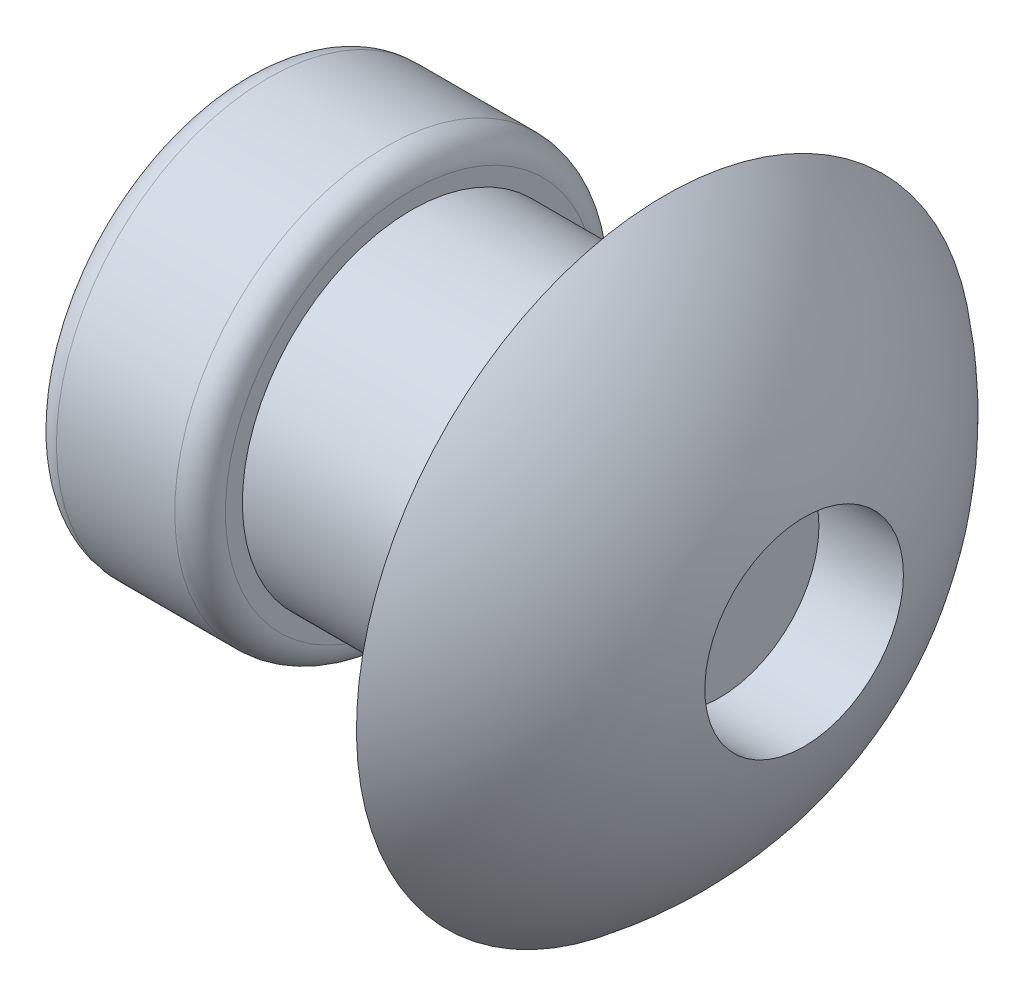
ISO-10303-21;
HEADER;
FILE_DESCRIPTION(('STEP AP214'),'2;1');
FILE_NAME('part.step','',(''),(''),'','','');
FILE_SCHEMA(('AUTOMOTIVE_DESIGN { 1 0 10303 214 1 1 1 1 }'));
ENDSEC;
DATA;
#1=APPLICATION_CONTEXT('core data for automotive mechanical design processes');
#2=APPLICATION_PROTOCOL_DEFINITION('international standard','automotive_design',2000,#1);
#3=PRODUCT_CONTEXT('',#1,'mechanical');
#4=PRODUCT('Part','Part','',(#3));
#5=PRODUCT_RELATED_PRODUCT_CATEGORY('part','',(#4));
#6=PRODUCT_DEFINITION_FORMATION('','',#4);
#7=PRODUCT_DEFINITION_CONTEXT('part definition',#1,'design');
#8=PRODUCT_DEFINITION('design','',#6,#7);
#9=PRODUCT_DEFINITION_SHAPE('','',#8);
#10=(LENGTH_UNIT() NAMED_UNIT(*) SI_UNIT(.MILLI.,.METRE.));
#11=(NAMED_UNIT(*) PLANE_ANGLE_UNIT() SI_UNIT($,.RADIAN.));
#12=(NAMED_UNIT(*) SI_UNIT($,.STERADIAN.) SOLID_ANGLE_UNIT());
#13=UNCERTAINTY_MEASURE_WITH_UNIT(LENGTH_MEASURE(1.E-05),#10,'distance_accuracy_value','');
#14=(GEOMETRIC_REPRESENTATION_CONTEXT(3) GLOBAL_UNCERTAINTY_ASSIGNED_CONTEXT((#13)) GLOBAL_UNIT_ASSIGNED_CONTEXT((#10,
#11,#12)) REPRESENTATION_CONTEXT('',''));
#15=CARTESIAN_POINT('',(0.,0.,0.));
#16=DIRECTION('',(0.,0.,1.));
#17=DIRECTION('',(1.,0.,0.));
#18=AXIS2_PLACEMENT_3D('',#15,#16,#17);
#19=CARTESIAN_POINT('',(2.5,-2.,0.));
#20=DIRECTION('',(-1.,0.,0.));
#21=DIRECTION('',(0.,-1.,0.));
#22=AXIS2_PLACEMENT_3D('',#19,#20,#21);
#23=PLANE('',#22);
#24=CARTESIAN_POINT('',(2.5,0.,0.));
#25=DIRECTION('',(1.,0.,0.));
#26=DIRECTION('',(0.,1.,0.));
#27=AXIS2_PLACEMENT_3D('',#24,#25,#26);
#28=CIRCLE('',#27,2.);
#29=CARTESIAN_POINT('',(2.5,2.,0.));
#30=VERTEX_POINT('',#29);
#31=EDGE_CURVE('E68',#30,#30,#28,.T.);
#32=ORIENTED_EDGE('',*,*,#31,.F.);
#33=EDGE_LOOP('',(#32));
#34=FACE_BOUND('',#33,.T.);
#35=CARTESIAN_POINT('',(2.5,0.,0.));
#36=DIRECTION('',(1.,0.,0.));
#37=DIRECTION('',(0.,1.,0.));
#38=AXIS2_PLACEMENT_3D('',#35,#36,#37);
#39=CIRCLE('',#38,2.2);
#40=CARTESIAN_POINT('',(2.5,2.2,0.));
#41=VERTEX_POINT('',#40);
#42=EDGE_CURVE('E44',#41,#41,#39,.T.);
#43=ORIENTED_EDGE('',*,*,#42,.T.);
#44=EDGE_LOOP('',(#43));
#45=FACE_BOUND('',#44,.T.);
#46=ADVANCED_FACE('F33',(#34,#45),#23,.F.);
#47=CARTESIAN_POINT('',(2.2,0.,0.));
#48=DIRECTION('',(1.,0.,0.));
#49=DIRECTION('',(0.,1.,0.));
#50=AXIS2_PLACEMENT_3D('',#47,#48,#49);
#51=TOROIDAL_SURFACE('',#50,2.2,0.300000000000001);
#52=ORIENTED_EDGE('',*,*,#42,.F.);
#53=EDGE_LOOP('',(#52));
#54=FACE_BOUND('',#53,.T.);
#55=CARTESIAN_POINT('',(2.2,0.,0.));
#56=DIRECTION('',(1.,0.,0.));
#57=DIRECTION('',(0.,1.,0.));
#58=AXIS2_PLACEMENT_3D('',#55,#56,#57);
#59=CIRCLE('',#58,2.5);
#60=CARTESIAN_POINT('',(2.2,2.5,0.));
#61=VERTEX_POINT('',#60);
#62=EDGE_CURVE('E48',#61,#61,#59,.T.);
#63=ORIENTED_EDGE('',*,*,#62,.T.);
#64=EDGE_LOOP('',(#63));
#65=FACE_BOUND('',#64,.T.);
#66=ADVANCED_FACE('F102',(#54,#65),#51,.T.);
#67=CARTESIAN_POINT('',(22.234231881893,0.,0.));
#68=DIRECTION('',(1.,0.,0.));
#69=DIRECTION('',(0.,1.,0.));
#70=AXIS2_PLACEMENT_3D('',#67,#68,#69);
#71=CYLINDRICAL_SURFACE('',#70,2.5);
#72=ORIENTED_EDGE('',*,*,#62,.F.);
#73=EDGE_LOOP('',(#72));
#74=FACE_BOUND('',#73,.T.);
#75=CARTESIAN_POINT('',(0.800000000000002,0.,0.));
#76=DIRECTION('',(1.,0.,0.));
#77=DIRECTION('',(0.,1.,0.));
#78=AXIS2_PLACEMENT_3D('',#75,#76,#77);
#79=CIRCLE('',#78,2.5);
#80=CARTESIAN_POINT('',(0.800000000000002,2.5,0.));
#81=VERTEX_POINT('',#80);
#82=EDGE_CURVE('E53',#81,#81,#79,.T.);
#83=ORIENTED_EDGE('',*,*,#82,.T.);
#84=EDGE_LOOP('',(#83));
#85=FACE_BOUND('',#84,.T.);
#86=ADVANCED_FACE('F107',(#74,#85),#71,.T.);
#87=CARTESIAN_POINT('',(0.800000000000002,0.,0.));
#88=DIRECTION('',(1.,0.,0.));
#89=DIRECTION('',(0.,1.,0.));
#90=AXIS2_PLACEMENT_3D('',#87,#88,#89);
#91=TOROIDAL_SURFACE('',#90,2.2,0.300000000000003);
#92=ORIENTED_EDGE('',*,*,#82,.F.);
#93=EDGE_LOOP('',(#92));
#94=FACE_BOUND('',#93,.T.);
#95=CARTESIAN_POINT('',(0.5,0.,0.));
#96=DIRECTION('',(1.,0.,0.));
#97=DIRECTION('',(0.,1.,0.));
#98=AXIS2_PLACEMENT_3D('',#95,#96,#97);
#99=CIRCLE('',#98,2.2);
#100=CARTESIAN_POINT('',(0.5,2.2,0.));
#101=VERTEX_POINT('',#100);
#102=EDGE_CURVE('E56',#101,#101,#99,.T.);
#103=ORIENTED_EDGE('',*,*,#102,.T.);
#104=EDGE_LOOP('',(#103));
#105=FACE_BOUND('',#104,.T.);
#106=ADVANCED_FACE('F115',(#94,#105),#91,.T.);
#107=CARTESIAN_POINT('',(0.500000000000002,-2.2,0.));
#108=DIRECTION('',(1.,0.,0.));
#109=DIRECTION('',(0.,1.,0.));
#110=AXIS2_PLACEMENT_3D('',#107,#108,#109);
#111=PLANE('',#110);
#112=ORIENTED_EDGE('',*,*,#102,.F.);
#113=EDGE_LOOP('',(#112));
#114=FACE_BOUND('',#113,.T.);
#115=CARTESIAN_POINT('',(0.5,0.,0.));
#116=DIRECTION('',(1.,0.,0.));
#117=DIRECTION('',(0.,1.,0.));
#118=AXIS2_PLACEMENT_3D('',#115,#116,#117);
#119=CIRCLE('',#118,1.8747533557385);
#120=CARTESIAN_POINT('',(0.5,1.8747533557385,0.));
#121=VERTEX_POINT('',#120);
#122=EDGE_CURVE('E59',#121,#121,#119,.T.);
#123=ORIENTED_EDGE('',*,*,#122,.T.);
#124=EDGE_LOOP('',(#123));
#125=FACE_BOUND('',#124,.T.);
#126=ADVANCED_FACE('F119',(#114,#125),#111,.F.);
#127=CARTESIAN_POINT('',(0.984568433375762,0.,0.));
#128=DIRECTION('',(1.,0.,0.));
#129=DIRECTION('',(0.,1.,0.));
#130=AXIS2_PLACEMENT_3D('',#127,#128,#129);
#131=TOROIDAL_SURFACE('',#130,1.,1.);
#132=ORIENTED_EDGE('',*,*,#122,.F.);
#133=EDGE_LOOP('',(#132));
#134=FACE_BOUND('',#133,.T.);
#135=CARTESIAN_POINT('',(0.,0.,0.));
#136=DIRECTION('',(1.,0.,0.));
#137=DIRECTION('',(0.,1.,0.));
#138=AXIS2_PLACEMENT_3D('',#135,#136,#137);
#139=CIRCLE('',#138,1.175);
#140=CARTESIAN_POINT('',(0.,1.175,0.));
#141=VERTEX_POINT('',#140);
#142=EDGE_CURVE('E62',#141,#141,#139,.T.);
#143=ORIENTED_EDGE('',*,*,#142,.T.);
#144=EDGE_LOOP('',(#143));
#145=FACE_BOUND('',#144,.T.);
#146=ADVANCED_FACE('F123',(#134,#145),#131,.T.);
#147=CARTESIAN_POINT('',(0.,-1.175,0.));
#148=DIRECTION('',(1.,0.,0.));
#149=DIRECTION('',(0.,1.,0.));
#150=AXIS2_PLACEMENT_3D('',#147,#148,#149);
#151=PLANE('',#150);
#152=ORIENTED_EDGE('',*,*,#142,.F.);
#153=EDGE_LOOP('',(#152));
#154=FACE_BOUND('',#153,.T.);
#155=ADVANCED_FACE('F90',(#154),#151,.F.);
#156=CARTESIAN_POINT('',(2.69930555555555,0.,0.));
#157=DIRECTION('',(1.,0.,0.));
#158=DIRECTION('',(0.,-1.,0.));
#159=AXIS2_PLACEMENT_3D('',#156,#157,#158);
#160=SPHERICAL_SURFACE('',#159,4.60069444444444);
#161=CARTESIAN_POINT('',(7.14742475035485,0.,0.));
#162=DIRECTION('',(-1.,0.,0.));
#163=DIRECTION('',(0.,0.,1.));
#164=AXIS2_PLACEMENT_3D('',#161,#162,#163);
#165=CIRCLE('',#164,1.175);
#166=CARTESIAN_POINT('',(7.14742475035485,-1.17500000000001,0.));
#167=VERTEX_POINT('',#166);
#168=EDGE_CURVE('E71',#167,#167,#165,.T.);
#169=CARTESIAN_POINT('',(5.5,0.,0.));
#170=DIRECTION('',(1.,0.,0.));
#171=DIRECTION('',(0.,1.,0.));
#172=AXIS2_PLACEMENT_3D('',#169,#170,#171);
#173=CIRCLE('',#172,3.65);
#174=CARTESIAN_POINT('',(5.5,-3.65,0.));
#175=VERTEX_POINT('',#174);
#176=EDGE_CURVE('E65',#175,#175,#173,.T.);
#177=CARTESIAN_POINT('',(7.14742475035485,-1.17500000000001,0.));
#178=CARTESIAN_POINT('',(7.13937055434425,-1.20549042585137,0.));
#179=CARTESIAN_POINT('',(7.13100276247918,-1.23589801147712,0.));
#180=CARTESIAN_POINT('',(7.11364373340068,-1.29653470351986,0.));
#181=CARTESIAN_POINT('',(7.10465249618726,-1.32676380993684,0.));
#182=CARTESIAN_POINT('',(7.08605032277266,-1.38703074480452,0.));
#183=CARTESIAN_POINT('',(7.07643938657149,-1.41706857325522,0.));
#184=CARTESIAN_POINT('',(7.05660189423072,-1.47694025454019,0.));
#185=CARTESIAN_POINT('',(7.04637533809112,-1.50677410737447,0.));
#186=CARTESIAN_POINT('',(7.02531092631849,-1.5662252206118,0.));
#187=CARTESIAN_POINT('',(7.01447307068547,-1.59584248101485,0.));
#188=CARTESIAN_POINT('',(6.99219064393945,-1.65484788561605,0.));
#189=CARTESIAN_POINT('',(6.98074607282645,-1.68423602981419,0.));
#190=CARTESIAN_POINT('',(6.95725505433323,-1.7427707747279,0.));
#191=CARTESIAN_POINT('',(6.94520860695302,-1.77191737544346,0.));
#192=CARTESIAN_POINT('',(6.92051893001421,-1.82995670835866,0.));
#193=CARTESIAN_POINT('',(6.90787570045563,-1.85884944055831,0.));
#194=CARTESIAN_POINT('',(6.88199780550921,-1.91636881873234,0.));
#195=CARTESIAN_POINT('',(6.86876314012138,-1.94499546470673,0.));
#196=CARTESIAN_POINT('',(6.84170796998881,-2.00197056524675,0.));
#197=CARTESIAN_POINT('',(6.82788746524408,-2.03031901981238,0.));
#198=CARTESIAN_POINT('',(6.79966646059354,-2.08672574998656,0.));
#199=CARTESIAN_POINT('',(6.78526596068774,-2.11478402559512,0.));
#200=CARTESIAN_POINT('',(6.75589105517203,-2.17059853301368,0.));
#201=CARTESIAN_POINT('',(6.74091664956212,-2.19835476482369,0.));
#202=CARTESIAN_POINT('',(6.71040026477882,-2.25355344752709,0.));
#203=CARTESIAN_POINT('',(6.69485828560544,-2.28099589842047,0.));
#204=CARTESIAN_POINT('',(6.66321332584254,-2.33555541485929,0.));
#205=CARTESIAN_POINT('',(6.64711034525302,-2.36267248040472,0.));
#206=CARTESIAN_POINT('',(6.61435019203262,-2.41656975931014,0.));
#207=CARTESIAN_POINT('',(6.59769301940173,-2.44334997267012,0.));
#208=CARTESIAN_POINT('',(6.56383152582132,-2.49656222280989,0.));
#209=CARTESIAN_POINT('',(6.54662720487182,-2.52299425958968,0.));
#210=CARTESIAN_POINT('',(6.5116786897464,-2.57549897940572,0.));
#211=CARTESIAN_POINT('',(6.4939344955705,-2.60157166244198,0.));
#212=CARTESIAN_POINT('',(6.45791373737759,-2.65334664956551,0.));
#213=CARTESIAN_POINT('',(6.43963717336059,-2.67904895365277,0.));
#214=CARTESIAN_POINT('',(6.40255940399098,-2.73007231429284,0.));
#215=CARTESIAN_POINT('',(6.38375819863837,-2.75539337084565,0.));
#216=CARTESIAN_POINT('',(6.34563909695507,-2.8056435290473,0.));
#217=CARTESIAN_POINT('',(6.32632120062438,-2.83057263069615,0.));
#218=CARTESIAN_POINT('',(6.2871768858326,-2.88002833746407,0.));
#219=CARTESIAN_POINT('',(6.2673504673715,-2.90455494258314,0.));
#220=CARTESIAN_POINT('',(6.22719749220249,-2.9531952848672,0.));
#221=CARTESIAN_POINT('',(6.20687093549456,-2.97730902203218,0.));
#222=CARTESIAN_POINT('',(6.16572627920572,-3.02511343157044,0.));
#223=CARTESIAN_POINT('',(6.1449081796248,-3.04880410394371,0.));
#224=CARTESIAN_POINT('',(6.10278924082093,-3.09575236596141,0.));
#225=CARTESIAN_POINT('',(6.08148840159797,-3.11900995560585,0.));
#226=CARTESIAN_POINT('',(6.03841299086977,-3.16508221735825,0.));
#227=CARTESIAN_POINT('',(6.01663841936453,-3.18789688946623,0.));
#228=CARTESIAN_POINT('',(5.97262475177293,-3.23307366865334,0.));
#229=CARTESIAN_POINT('',(5.95038565568657,-3.25543577573247,0.));
#230=CARTESIAN_POINT('',(5.90545234300135,-3.29969796866382,0.));
#231=CARTESIAN_POINT('',(5.88275812640248,-3.32159805451605,0.));
#232=CARTESIAN_POINT('',(5.83692416945171,-3.3649269444635,0.));
#233=CARTESIAN_POINT('',(5.81378442909982,-3.38635574855872,0.));
#234=CARTESIAN_POINT('',(5.76706920891518,-3.42873301264673,0.));
#235=CARTESIAN_POINT('',(5.74349372908242,-3.44968147263952,0.));
#236=CARTESIAN_POINT('',(5.69591700176373,-3.491089193416,0.));
#237=CARTESIAN_POINT('',(5.6719157542778,-3.51154845419969,0.));
#238=CARTESIAN_POINT('',(5.6234976312183,-3.55196911294601,0.));
#239=CARTESIAN_POINT('',(5.59908075564474,-3.57193051090865,0.));
#240=CARTESIAN_POINT('',(5.54984173764904,-3.61134704829149,0.));
#241=CARTESIAN_POINT('',(5.5250195952269,-3.6308021877117,0.));
#242=CARTESIAN_POINT('',(5.5,-3.65,0.));
#243=B_SPLINE_CURVE_WITH_KNOTS('',3,(#177,#178,#179,#180,#181,#182,#183,#184,#185,#186,#187,
#188,#189,#190,#191,#192,#193,#194,#195,#196,#197,#198,#199,#200,#201,#202,#203,#204,#205,#206,
#207,#208,#209,#210,#211,#212,#213,#214,#215,#216,#217,#218,#219,#220,#221,#222,#223,#224,#225,
#226,#227,#228,#229,#230,#231,#232,#233,#234,#235,#236,#237,#238,#239,#240,#241,#242),
.UNSPECIFIED.,.F.,.F.,(4,2,2,2,2,2,2,2,2,2,2,2,2,2,2,2,2,2,2,2,2,2,2,2,2,2,2,2,2,2,2,2,4),(0.,
0.0946071313315107,0.189214262663021,0.283821393994532,0.378428525326042,0.473035656657552,
0.567642787989063,0.662249919320573,0.756857050652084,0.851464181983594,0.946071313315105,
1.04067844464662,1.13528557597813,1.22989270730964,1.32449983864115,1.41910696997266,
1.51371410130417,1.60832123263568,1.70292836396719,1.7975354952987,1.89214262663021,
1.98674975796172,2.08135688929323,2.17596402062474,2.27057115195625,2.36517828328776,
2.45978541461927,2.55439254595078,2.64899967728229,2.74360680861381,2.83821393994532,
2.93282107127683,3.02742820260834),.UNSPECIFIED.);
#244=EDGE_CURVE('BSEAM86',#167,#175,#243,.T.);
#245=ORIENTED_EDGE('',*,*,#168,.T.);
#246=ORIENTED_EDGE('',*,*,#176,.T.);
#247=ORIENTED_EDGE('',*,*,#244,.T.);
#248=ORIENTED_EDGE('',*,*,#244,.F.);
#249=EDGE_LOOP('',(#245,#247,#246,#248));
#250=FACE_BOUND('',#249,.T.);
#251=ADVANCED_FACE('F86',(#250),#160,.T.);
#252=CARTESIAN_POINT('',(5.5,-2.,0.));
#253=DIRECTION('',(1.,0.,0.));
#254=DIRECTION('',(0.,1.,0.));
#255=AXIS2_PLACEMENT_3D('',#252,#253,#254);
#256=PLANE('',#255);
#257=CARTESIAN_POINT('',(5.5,0.,0.));
#258=DIRECTION('',(1.,0.,0.));
#259=DIRECTION('',(0.,1.,0.));
#260=AXIS2_PLACEMENT_3D('',#257,#258,#259);
#261=CIRCLE('',#260,2.5);
#262=CARTESIAN_POINT('',(5.5,2.5,0.));
#263=VERTEX_POINT('',#262);
#264=EDGE_CURVE('E40',#263,#263,#261,.T.);
#265=ORIENTED_EDGE('',*,*,#264,.T.);
#266=EDGE_LOOP('',(#265));
#267=FACE_BOUND('',#266,.T.);
#268=ORIENTED_EDGE('',*,*,#176,.F.);
#269=EDGE_LOOP('',(#268));
#270=FACE_BOUND('',#269,.T.);
#271=ADVANCED_FACE('F89',(#267,#270),#256,.F.);
#272=CARTESIAN_POINT('',(22.234231881893,0.,0.));
#273=DIRECTION('',(1.,0.,0.));
#274=DIRECTION('',(0.,1.,0.));
#275=AXIS2_PLACEMENT_3D('',#272,#273,#274);
#276=CYLINDRICAL_SURFACE('',#275,2.);
#277=CARTESIAN_POINT('',(5.,0.,0.));
#278=DIRECTION('',(1.,0.,0.));
#279=DIRECTION('',(0.,1.,0.));
#280=AXIS2_PLACEMENT_3D('',#277,#278,#279);
#281=CIRCLE('',#280,2.);
#282=CARTESIAN_POINT('',(5.,2.,0.));
#283=VERTEX_POINT('',#282);
#284=EDGE_CURVE('E10',#283,#283,#281,.F.);
#285=ORIENTED_EDGE('',*,*,#284,.T.);
#286=EDGE_LOOP('',(#285));
#287=FACE_BOUND('',#286,.T.);
#288=ORIENTED_EDGE('',*,*,#31,.T.);
#289=EDGE_LOOP('',(#288));
#290=FACE_BOUND('',#289,.T.);
#291=ADVANCED_FACE('F95',(#287,#290),#276,.T.);
#292=CARTESIAN_POINT('',(5.,0.,0.));
#293=DIRECTION('',(1.,0.,0.));
#294=DIRECTION('',(0.,1.,0.));
#295=AXIS2_PLACEMENT_3D('',#292,#293,#294);
#296=TOROIDAL_SURFACE('',#295,2.5,0.5);
#297=ORIENTED_EDGE('',*,*,#284,.F.);
#298=EDGE_LOOP('',(#297));
#299=FACE_BOUND('',#298,.T.);
#300=ORIENTED_EDGE('',*,*,#264,.F.);
#301=EDGE_LOOP('',(#300));
#302=FACE_BOUND('',#301,.T.);
#303=ADVANCED_FACE('F35',(#299,#302),#296,.F.);
#304=CARTESIAN_POINT('',(35.1474247503549,0.,0.));
#305=DIRECTION('',(1.,0.,0.));
#306=DIRECTION('',(0.,0.,-1.));
#307=AXIS2_PLACEMENT_3D('',#304,#305,#306);
#308=CYLINDRICAL_SURFACE('',#307,1.175);
#309=CARTESIAN_POINT('',(6.14742475035485,0.,0.));
#310=DIRECTION('',(1.,0.,0.));
#311=DIRECTION('',(0.,0.,-1.));
#312=AXIS2_PLACEMENT_3D('',#309,#310,#311);
#313=CIRCLE('',#312,1.175);
#314=CARTESIAN_POINT('',(6.14742475035485,0.,-1.175));
#315=VERTEX_POINT('',#314);
#316=EDGE_CURVE('E74',#315,#315,#313,.T.);
#317=ORIENTED_EDGE('',*,*,#316,.F.);
#318=EDGE_LOOP('',(#317));
#319=FACE_BOUND('',#318,.T.);
#320=ORIENTED_EDGE('',*,*,#168,.F.);
#321=EDGE_LOOP('',(#320));
#322=FACE_BOUND('',#321,.T.);
#323=ADVANCED_FACE('F80',(#319,#322),#308,.F.);
#324=CARTESIAN_POINT('',(6.14742475035485,0.,-1.175));
#325=DIRECTION('',(-1.,0.,0.));
#326=DIRECTION('',(0.,0.,1.));
#327=AXIS2_PLACEMENT_3D('',#324,#325,#326);
#328=PLANE('',#327);
#329=ORIENTED_EDGE('',*,*,#316,.T.);
#330=EDGE_LOOP('',(#329));
#331=FACE_BOUND('',#330,.T.);
#332=ADVANCED_FACE('F78',(#331),#328,.F.);
#333=CLOSED_SHELL('',(#46,#66,#86,#106,#126,#146,#155,#251,#271,#291,#303,#323,#332));
#334=MANIFOLD_SOLID_BREP('B2',#333);
#335=ADVANCED_BREP_SHAPE_REPRESENTATION('',(#18,#334),#14);
#336=SHAPE_DEFINITION_REPRESENTATION(#9,#335);
ENDSEC;
END-ISO-10303-21;
